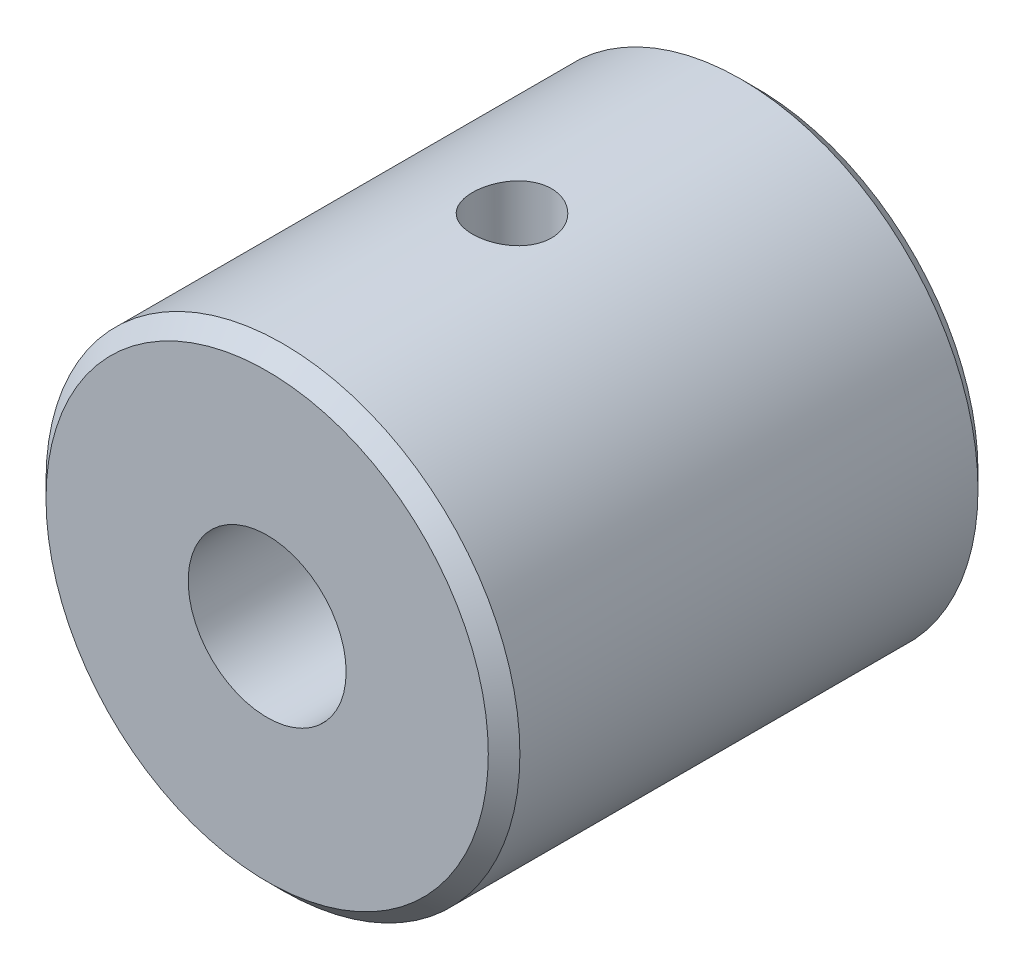
ISO-10303-21;
HEADER;
FILE_DESCRIPTION(('STEP AP214'),'2;1');
FILE_NAME('part.step','',(''),(''),'','','');
FILE_SCHEMA(('AUTOMOTIVE_DESIGN { 1 0 10303 214 1 1 1 1 }'));
ENDSEC;
DATA;
#1=APPLICATION_CONTEXT('core data for automotive mechanical design processes');
#2=APPLICATION_PROTOCOL_DEFINITION('international standard','automotive_design',2000,#1);
#3=PRODUCT_CONTEXT('',#1,'mechanical');
#4=PRODUCT('Part','Part','',(#3));
#5=PRODUCT_RELATED_PRODUCT_CATEGORY('part','',(#4));
#6=PRODUCT_DEFINITION_FORMATION('','',#4);
#7=PRODUCT_DEFINITION_CONTEXT('part definition',#1,'design');
#8=PRODUCT_DEFINITION('design','',#6,#7);
#9=PRODUCT_DEFINITION_SHAPE('','',#8);
#10=(LENGTH_UNIT() NAMED_UNIT(*) SI_UNIT(.MILLI.,.METRE.));
#11=(NAMED_UNIT(*) PLANE_ANGLE_UNIT() SI_UNIT($,.RADIAN.));
#12=(NAMED_UNIT(*) SI_UNIT($,.STERADIAN.) SOLID_ANGLE_UNIT());
#13=UNCERTAINTY_MEASURE_WITH_UNIT(LENGTH_MEASURE(1.E-05),#10,'distance_accuracy_value','');
#14=(GEOMETRIC_REPRESENTATION_CONTEXT(3) GLOBAL_UNCERTAINTY_ASSIGNED_CONTEXT((#13)) GLOBAL_UNIT_ASSIGNED_CONTEXT((#10,
#11,#12)) REPRESENTATION_CONTEXT('',''));
#15=CARTESIAN_POINT('',(0.,0.,0.));
#16=DIRECTION('',(0.,0.,1.));
#17=DIRECTION('',(1.,0.,0.));
#18=AXIS2_PLACEMENT_3D('',#15,#16,#17);
#19=CARTESIAN_POINT('',(0.,0.,3.937));
#20=DIRECTION('',(0.,0.,-1.));
#21=DIRECTION('',(-1.,0.,0.));
#22=AXIS2_PLACEMENT_3D('',#19,#20,#21);
#23=CYLINDRICAL_SURFACE('',#22,3.81);
#24=CARTESIAN_POINT('',(0.,-3.81,0.635));
#25=CARTESIAN_POINT('',(0.0354052898593866,-3.80999939336881,0.634998580407255));
#26=CARTESIAN_POINT('',(0.0708299019870605,-3.80950134189911,0.632028892157894));
#27=CARTESIAN_POINT('',(0.140685576304953,-3.80756247615112,0.620233542673608));
#28=CARTESIAN_POINT('',(0.175115694461649,-3.80612079496668,0.611402496544453));
#29=CARTESIAN_POINT('',(0.241961605792011,-3.80245637332058,0.58815847605744));
#30=CARTESIAN_POINT('',(0.274379021581703,-3.80023427190435,0.573750067727294));
#31=CARTESIAN_POINT('',(0.336332027862398,-3.79525333678846,0.539772277818692));
#32=CARTESIAN_POINT('',(0.365867947429162,-3.79249456448626,0.520203486519319));
#33=CARTESIAN_POINT('',(0.421506044030087,-3.78671662634411,0.476261408709604));
#34=CARTESIAN_POINT('',(0.447576677497882,-3.78369543440974,0.451848444882423));
#35=CARTESIAN_POINT('',(0.495271678659622,-3.7777486722669,0.398996416007906));
#36=CARTESIAN_POINT('',(0.516895765645307,-3.77482310810517,0.370557096970021));
#37=CARTESIAN_POINT('',(0.555210249903704,-3.76937921702984,0.310242974585948));
#38=CARTESIAN_POINT('',(0.571869456426694,-3.76686350789275,0.278348100451592));
#39=CARTESIAN_POINT('',(0.59958182481445,-3.76255226607847,0.212163770667641));
#40=CARTESIAN_POINT('',(0.610635365357666,-3.76075668475634,0.177874476945882));
#41=CARTESIAN_POINT('',(0.626723251957341,-3.7581091635806,0.108209010186439));
#42=CARTESIAN_POINT('',(0.631812053400392,-3.75724869195368,0.0728457429286464));
#43=CARTESIAN_POINT('',(0.635994848223628,-3.75654300489909,0.00175760967159828));
#44=CARTESIAN_POINT('',(0.635089265858805,-3.75669771762132,-0.0339672305584941));
#45=CARTESIAN_POINT('',(0.627353354992623,-3.75799712931343,-0.104375676763964));
#46=CARTESIAN_POINT('',(0.620584200000002,-3.75913160623005,-0.139066220100489));
#47=CARTESIAN_POINT('',(0.601409297662475,-3.76224671783596,-0.2068122147286));
#48=CARTESIAN_POINT('',(0.589003356997214,-3.76422738154611,-0.239867609897691));
#49=CARTESIAN_POINT('',(0.558845020507854,-3.76882273750861,-0.303588121153994));
#50=CARTESIAN_POINT('',(0.541067222125447,-3.77144043045261,-0.334240989144632));
#51=CARTESIAN_POINT('',(0.500687852459588,-3.77701281277412,-0.39215171773675));
#52=CARTESIAN_POINT('',(0.478085891846189,-3.77996752934189,-0.419409304043553));
#53=CARTESIAN_POINT('',(0.428366481888399,-3.78592595081466,-0.470109825795066));
#54=CARTESIAN_POINT('',(0.401196546823774,-3.7889298090484,-0.493501303709181));
#55=CARTESIAN_POINT('',(0.343289953241338,-3.79461420754768,-0.535400951716997));
#56=CARTESIAN_POINT('',(0.312553271744231,-3.79729474572995,-0.55390909034654));
#57=CARTESIAN_POINT('',(0.248337302706344,-3.802034287948,-0.585521365692616));
#58=CARTESIAN_POINT('',(0.214855736293424,-3.80409276875492,-0.598620956510139));
#59=CARTESIAN_POINT('',(0.146125779783093,-3.80735205765215,-0.618996530672479));
#60=CARTESIAN_POINT('',(0.110877537751585,-3.8085529374902,-0.626273001191324));
#61=CARTESIAN_POINT('',(0.040058314930612,-3.80995206980042,-0.634726025049128));
#62=CARTESIAN_POINT('',(0.00449598723635638,-3.81016193265247,-0.635973219238624));
#63=CARTESIAN_POINT('',(-0.0663295023140319,-3.80958718502977,-0.632520618515257));
#64=CARTESIAN_POINT('',(-0.101592675628578,-3.80880261281926,-0.627821052424031));
#65=CARTESIAN_POINT('',(-0.170600668588878,-3.80633434042303,-0.612667088268788));
#66=CARTESIAN_POINT('',(-0.204353380569887,-3.80465610619533,-0.602247663068908));
#67=CARTESIAN_POINT('',(-0.269632908754553,-3.80058793971661,-0.575987032377318));
#68=CARTESIAN_POINT('',(-0.301159599841069,-3.79819796750053,-0.560145522420641));
#69=CARTESIAN_POINT('',(-0.361398995125116,-3.79294267140812,-0.523328614327016));
#70=CARTESIAN_POINT('',(-0.390084373738036,-3.79007333395304,-0.502309090333517));
#71=CARTESIAN_POINT('',(-0.443545870717683,-3.78418970717543,-0.455793521892194));
#72=CARTESIAN_POINT('',(-0.468321704882932,-3.78117540733573,-0.430297152287725));
#73=CARTESIAN_POINT('',(-0.513522666033133,-3.77530404509905,-0.375234822789858));
#74=CARTESIAN_POINT('',(-0.533900065322884,-3.77244893498825,-0.345629441959339));
#75=CARTESIAN_POINT('',(-0.569392386814927,-3.76725568563582,-0.283374345838811));
#76=CARTESIAN_POINT('',(-0.584507475831535,-3.76491753000769,-0.250724727092216));
#77=CARTESIAN_POINT('',(-0.60897473619418,-3.76103757239217,-0.183441407865718));
#78=CARTESIAN_POINT('',(-0.618350663867178,-3.7594924919501,-0.148816543862255));
#79=CARTESIAN_POINT('',(-0.631148205259683,-3.75736540076156,-0.0784554871776719));
#80=CARTESIAN_POINT('',(-0.634570336634327,-3.75678330628811,-0.0427193913880582));
#81=CARTESIAN_POINT('',(-0.635348707976027,-3.75665170203339,0.0283731121544526));
#82=CARTESIAN_POINT('',(-0.632780074575797,-3.75708940352435,0.063728696158124));
#83=CARTESIAN_POINT('',(-0.621812279095039,-3.75892004489247,0.133497129004895));
#84=CARTESIAN_POINT('',(-0.613413135912569,-3.76031298167348,0.167909980903236));
#85=CARTESIAN_POINT('',(-0.591051520357105,-3.76389228495557,0.234787043072325));
#86=CARTESIAN_POINT('',(-0.577095516012512,-3.76607772873796,0.267253468554231));
#87=CARTESIAN_POINT('',(-0.544024058994641,-3.77099669706241,0.329396259975492));
#88=CARTESIAN_POINT('',(-0.524908350422135,-3.77373024878653,0.359072487434523));
#89=CARTESIAN_POINT('',(-0.481791996630527,-3.77947797327588,0.41517203810937));
#90=CARTESIAN_POINT('',(-0.457736083152786,-3.78249509076381,0.44155258824187));
#91=CARTESIAN_POINT('',(-0.405538693970578,-3.78844650579654,0.489928307536634));
#92=CARTESIAN_POINT('',(-0.377396276679809,-3.79138078406743,0.511922463234096));
#93=CARTESIAN_POINT('',(-0.317593769088631,-3.79685938529124,0.551039860122787));
#94=CARTESIAN_POINT('',(-0.285910728033335,-3.79940087528288,0.56812841398549));
#95=CARTESIAN_POINT('',(-0.220094319622261,-3.80377996570851,0.59671444909092));
#96=CARTESIAN_POINT('',(-0.185963431686822,-3.8056182667708,0.608217498594243));
#97=CARTESIAN_POINT('',(-0.126416640751531,-3.80798270871571,0.622809339628173));
#98=CARTESIAN_POINT('',(-0.101360942895805,-3.80873514927433,0.627373515282455));
#99=CARTESIAN_POINT('',(-0.0508734848212311,-3.80974400860475,0.633469329412567));
#100=CARTESIAN_POINT('',(-0.0254417310845573,-3.81000043591643,0.63500102009889));
#101=CARTESIAN_POINT('',(0.,-3.81,0.635));
#102=B_SPLINE_CURVE_WITH_KNOTS('',3,(#24,#25,#26,#27,#28,#29,#30,#31,#32,#33,#34,#35,#36,#37,
#38,#39,#40,#41,#42,#43,#44,#45,#46,#47,#48,#49,#50,#51,#52,#53,#54,#55,#56,#57,#58,#59,#60,#61,
#62,#63,#64,#65,#66,#67,#68,#69,#70,#71,#72,#73,#74,#75,#76,#77,#78,#79,#80,#81,#82,#83,#84,#85,
#86,#87,#88,#89,#90,#91,#92,#93,#94,#95,#96,#97,#98,#99,#100,#101),.UNSPECIFIED.,.T.,.F.,(4,2,2,
2,2,2,2,2,2,2,2,2,2,2,2,2,2,2,2,2,2,2,2,2,2,2,2,2,2,2,2,2,2,2,2,2,2,2,4),(0.,0.106122872574381,
0.212343376606637,0.318477104224419,0.424598696819397,0.531628327298323,0.638664712431436,
0.746360002892554,0.8540480172655,0.960745035842696,1.06743450297505,1.17302412527144,
1.27861736916447,1.3847179738467,1.49082714452866,1.59825123557477,1.70567601875505,
1.81319090984639,1.92069680508372,2.02694002406815,2.13317915511108,2.2387758297963,
2.34437843499821,2.45091413709264,2.55745758015788,2.66510470789935,2.7727484229349,
2.8799434967481,2.98712924997801,3.09297809018766,3.19882658731786,3.30455223829461,
3.41028313377451,3.51726851585122,3.62427858805259,3.73202766828229,3.83966911041038,
3.91592879033661,3.9921871572835),.UNSPECIFIED.);
#103=CARTESIAN_POINT('',(0.,-3.81,0.635));
#104=VERTEX_POINT('',#103);
#105=EDGE_CURVE('E76',#104,#104,#102,.T.);
#106=ORIENTED_EDGE('',*,*,#105,.T.);
#107=EDGE_LOOP('',(#106));
#108=FACE_BOUND('',#107,.T.);
#109=CARTESIAN_POINT('',(0.,3.81,0.635));
#110=CARTESIAN_POINT('',(-0.0354052898593866,3.80999939336881,0.634998580407255));
#111=CARTESIAN_POINT('',(-0.0708299019870606,3.8095013418991,0.632028892157894));
#112=CARTESIAN_POINT('',(-0.140685576304953,3.80756247615112,0.620233542673608));
#113=CARTESIAN_POINT('',(-0.175115694461649,3.80612079496668,0.611402496544453));
#114=CARTESIAN_POINT('',(-0.241961605792012,3.80245637332058,0.58815847605744));
#115=CARTESIAN_POINT('',(-0.274379021581703,3.80023427190435,0.573750067727294));
#116=CARTESIAN_POINT('',(-0.336332027862398,3.79525333678846,0.539772277818691));
#117=CARTESIAN_POINT('',(-0.365867947429162,3.79249456448626,0.520203486519318));
#118=CARTESIAN_POINT('',(-0.421506044030087,3.78671662634411,0.476261408709603));
#119=CARTESIAN_POINT('',(-0.447576677497882,3.78369543440974,0.451848444882423));
#120=CARTESIAN_POINT('',(-0.495271678659622,3.7777486722669,0.398996416007906));
#121=CARTESIAN_POINT('',(-0.516895765645307,3.77482310810517,0.37055709697002));
#122=CARTESIAN_POINT('',(-0.555210249903704,3.76937921702984,0.310242974585947));
#123=CARTESIAN_POINT('',(-0.571869456426695,3.76686350789275,0.278348100451591));
#124=CARTESIAN_POINT('',(-0.59958182481445,3.76255226607847,0.21216377066764));
#125=CARTESIAN_POINT('',(-0.610635365357666,3.76075668475634,0.177874476945881));
#126=CARTESIAN_POINT('',(-0.626723251957341,3.7581091635806,0.108209010186439));
#127=CARTESIAN_POINT('',(-0.631812053400392,3.75724869195368,0.0728457429286459));
#128=CARTESIAN_POINT('',(-0.635994848223628,3.75654300489909,0.00175760967159773));
#129=CARTESIAN_POINT('',(-0.635089265858805,3.75669771762132,-0.0339672305584946));
#130=CARTESIAN_POINT('',(-0.627353354992622,3.75799712931343,-0.104375676763964));
#131=CARTESIAN_POINT('',(-0.620584200000002,3.75913160623005,-0.13906622010049));
#132=CARTESIAN_POINT('',(-0.601409297662475,3.76224671783596,-0.2068122147286));
#133=CARTESIAN_POINT('',(-0.589003356997214,3.76422738154611,-0.239867609897691));
#134=CARTESIAN_POINT('',(-0.558845020507854,3.76882273750861,-0.303588121153994));
#135=CARTESIAN_POINT('',(-0.541067222125447,3.77144043045261,-0.334240989144632));
#136=CARTESIAN_POINT('',(-0.500687852459588,3.77701281277412,-0.39215171773675));
#137=CARTESIAN_POINT('',(-0.478085891846189,3.77996752934189,-0.419409304043553));
#138=CARTESIAN_POINT('',(-0.428366481888399,3.78592595081466,-0.470109825795066));
#139=CARTESIAN_POINT('',(-0.401196546823774,3.7889298090484,-0.493501303709181));
#140=CARTESIAN_POINT('',(-0.343289953241338,3.79461420754768,-0.535400951716997));
#141=CARTESIAN_POINT('',(-0.312553271744231,3.79729474572995,-0.55390909034654));
#142=CARTESIAN_POINT('',(-0.248337302706344,3.802034287948,-0.585521365692616));
#143=CARTESIAN_POINT('',(-0.214855736293424,3.80409276875492,-0.598620956510139));
#144=CARTESIAN_POINT('',(-0.146125779783093,3.80735205765215,-0.618996530672479));
#145=CARTESIAN_POINT('',(-0.110877537751585,3.8085529374902,-0.626273001191324));
#146=CARTESIAN_POINT('',(-0.0400583149306122,3.80995206980042,-0.634726025049128));
#147=CARTESIAN_POINT('',(-0.00449598723635661,3.81016193265247,-0.635973219238624));
#148=CARTESIAN_POINT('',(0.0663295023140317,3.80958718502977,-0.632520618515257));
#149=CARTESIAN_POINT('',(0.101592675628578,3.80880261281926,-0.627821052424031));
#150=CARTESIAN_POINT('',(0.170600668588878,3.80633434042303,-0.612667088268789));
#151=CARTESIAN_POINT('',(0.204353380569887,3.80465610619533,-0.602247663068908));
#152=CARTESIAN_POINT('',(0.269632908754553,3.80058793971661,-0.575987032377318));
#153=CARTESIAN_POINT('',(0.301159599841069,3.79819796750053,-0.560145522420641));
#154=CARTESIAN_POINT('',(0.361398995125116,3.79294267140812,-0.523328614327016));
#155=CARTESIAN_POINT('',(0.390084373738036,3.79007333395304,-0.502309090333518));
#156=CARTESIAN_POINT('',(0.443545870717683,3.78418970717543,-0.455793521892195));
#157=CARTESIAN_POINT('',(0.468321704882932,3.78117540733573,-0.430297152287726));
#158=CARTESIAN_POINT('',(0.513522666033133,3.77530404509905,-0.375234822789858));
#159=CARTESIAN_POINT('',(0.533900065322884,3.77244893498825,-0.345629441959339));
#160=CARTESIAN_POINT('',(0.569392386814927,3.76725568563582,-0.28337434583881));
#161=CARTESIAN_POINT('',(0.584507475831535,3.76491753000769,-0.250724727092216));
#162=CARTESIAN_POINT('',(0.60897473619418,3.76103757239217,-0.183441407865718));
#163=CARTESIAN_POINT('',(0.618350663867178,3.7594924919501,-0.148816543862255));
#164=CARTESIAN_POINT('',(0.631148205259683,3.75736540076156,-0.0784554871776718));
#165=CARTESIAN_POINT('',(0.634570336634327,3.75678330628811,-0.042719391388058));
#166=CARTESIAN_POINT('',(0.635348707976027,3.75665170203339,0.0283731121544527));
#167=CARTESIAN_POINT('',(0.632780074575797,3.75708940352435,0.063728696158124));
#168=CARTESIAN_POINT('',(0.621812279095039,3.75892004489247,0.133497129004895));
#169=CARTESIAN_POINT('',(0.613413135912569,3.76031298167348,0.167909980903236));
#170=CARTESIAN_POINT('',(0.591051520357105,3.76389228495557,0.234787043072325));
#171=CARTESIAN_POINT('',(0.577095516012512,3.76607772873796,0.267253468554231));
#172=CARTESIAN_POINT('',(0.54402405899464,3.77099669706241,0.329396259975492));
#173=CARTESIAN_POINT('',(0.524908350422134,3.77373024878653,0.359072487434523));
#174=CARTESIAN_POINT('',(0.481791996630527,3.77947797327588,0.41517203810937));
#175=CARTESIAN_POINT('',(0.457736083152786,3.78249509076381,0.44155258824187));
#176=CARTESIAN_POINT('',(0.405538693970578,3.78844650579654,0.489928307536634));
#177=CARTESIAN_POINT('',(0.377396276679809,3.79138078406743,0.511922463234096));
#178=CARTESIAN_POINT('',(0.317593769088631,3.79685938529124,0.551039860122787));
#179=CARTESIAN_POINT('',(0.285910728033335,3.79940087528288,0.56812841398549));
#180=CARTESIAN_POINT('',(0.22009431962226,3.80377996570851,0.59671444909092));
#181=CARTESIAN_POINT('',(0.185963431686821,3.8056182667708,0.608217498594243));
#182=CARTESIAN_POINT('',(0.126416640751531,3.80798270871571,0.622809339628173));
#183=CARTESIAN_POINT('',(0.101360942895805,3.80873514927433,0.627373515282455));
#184=CARTESIAN_POINT('',(0.0508734848212312,3.80974400860475,0.633469329412567));
#185=CARTESIAN_POINT('',(0.0254417310845573,3.81000043591643,0.63500102009889));
#186=CARTESIAN_POINT('',(0.,3.81,0.635));
#187=B_SPLINE_CURVE_WITH_KNOTS('',3,(#109,#110,#111,#112,#113,#114,#115,#116,#117,#118,#119,
#120,#121,#122,#123,#124,#125,#126,#127,#128,#129,#130,#131,#132,#133,#134,#135,#136,#137,#138,
#139,#140,#141,#142,#143,#144,#145,#146,#147,#148,#149,#150,#151,#152,#153,#154,#155,#156,#157,
#158,#159,#160,#161,#162,#163,#164,#165,#166,#167,#168,#169,#170,#171,#172,#173,#174,#175,#176,
#177,#178,#179,#180,#181,#182,#183,#184,#185,#186),.UNSPECIFIED.,.T.,.F.,(4,2,2,2,2,2,2,2,2,2,2,
2,2,2,2,2,2,2,2,2,2,2,2,2,2,2,2,2,2,2,2,2,2,2,2,2,2,2,4),(0.,0.106122872574382,
0.212343376606637,0.318477104224419,0.424598696819397,0.531628327298324,0.638664712431437,
0.746360002892554,0.854048017265501,0.960745035842697,1.06743450297505,1.17302412527144,
1.27861736916447,1.3847179738467,1.49082714452866,1.59825123557477,1.70567601875505,
1.81319090984639,1.92069680508372,2.02694002406815,2.13317915511108,2.2387758297963,
2.34437843499821,2.45091413709264,2.55745758015788,2.66510470789935,2.7727484229349,
2.8799434967481,2.98712924997801,3.09297809018766,3.19882658731786,3.30455223829461,
3.41028313377451,3.51726851585122,3.62427858805259,3.73202766828229,3.83966911041038,
3.91592879033661,3.9921871572835),.UNSPECIFIED.);
#188=CARTESIAN_POINT('',(0.,3.81,0.635));
#189=VERTEX_POINT('',#188);
#190=EDGE_CURVE('E70',#189,#189,#187,.T.);
#191=ORIENTED_EDGE('',*,*,#190,.T.);
#192=EDGE_LOOP('',(#191));
#193=FACE_BOUND('',#192,.T.);
#194=CARTESIAN_POINT('',(0.,0.,-3.683));
#195=DIRECTION('',(0.,0.,1.));
#196=DIRECTION('',(1.,0.,0.));
#197=AXIS2_PLACEMENT_3D('',#194,#195,#196);
#198=CIRCLE('',#197,3.81);
#199=CARTESIAN_POINT('',(3.81,0.,-3.683));
#200=VERTEX_POINT('',#199);
#201=EDGE_CURVE('E49',#200,#200,#198,.T.);
#202=ORIENTED_EDGE('',*,*,#201,.T.);
#203=EDGE_LOOP('',(#202));
#204=FACE_BOUND('',#203,.T.);
#205=CARTESIAN_POINT('',(0.,0.,3.683));
#206=DIRECTION('',(0.,0.,1.));
#207=DIRECTION('',(1.,0.,0.));
#208=AXIS2_PLACEMENT_3D('',#205,#206,#207);
#209=CIRCLE('',#208,3.81);
#210=CARTESIAN_POINT('',(3.81,0.,3.683));
#211=VERTEX_POINT('',#210);
#212=EDGE_CURVE('E102',#211,#211,#209,.F.);
#213=ORIENTED_EDGE('',*,*,#212,.T.);
#214=EDGE_LOOP('',(#213));
#215=FACE_BOUND('',#214,.T.);
#216=ADVANCED_FACE('F31',(#108,#193,#204,#215),#23,.T.);
#217=CARTESIAN_POINT('',(0.,0.,3.937));
#218=DIRECTION('',(0.,0.,1.));
#219=DIRECTION('',(1.,0.,0.));
#220=AXIS2_PLACEMENT_3D('',#217,#218,#219);
#221=PLANE('',#220);
#222=CARTESIAN_POINT('',(0.,0.,3.937));
#223=DIRECTION('',(0.,0.,1.));
#224=DIRECTION('',(1.,0.,0.));
#225=AXIS2_PLACEMENT_3D('',#222,#223,#224);
#226=CIRCLE('',#225,1.27);
#227=CARTESIAN_POINT('',(1.27,0.,3.937));
#228=VERTEX_POINT('',#227);
#229=EDGE_CURVE('E108',#228,#228,#226,.T.);
#230=ORIENTED_EDGE('',*,*,#229,.F.);
#231=EDGE_LOOP('',(#230));
#232=FACE_BOUND('',#231,.T.);
#233=CARTESIAN_POINT('',(0.,0.,3.937));
#234=DIRECTION('',(0.,0.,1.));
#235=DIRECTION('',(1.,0.,0.));
#236=AXIS2_PLACEMENT_3D('',#233,#234,#235);
#237=CIRCLE('',#236,3.556);
#238=CARTESIAN_POINT('',(3.556,0.,3.937));
#239=VERTEX_POINT('',#238);
#240=EDGE_CURVE('E10',#239,#239,#237,.T.);
#241=ORIENTED_EDGE('',*,*,#240,.T.);
#242=EDGE_LOOP('',(#241));
#243=FACE_BOUND('',#242,.T.);
#244=ADVANCED_FACE('F84',(#232,#243),#221,.T.);
#245=CARTESIAN_POINT('',(0.,0.,-3.937));
#246=DIRECTION('',(0.,0.,1.));
#247=DIRECTION('',(1.,0.,0.));
#248=AXIS2_PLACEMENT_3D('',#245,#246,#247);
#249=PLANE('',#248);
#250=CARTESIAN_POINT('',(0.,0.,-3.937));
#251=DIRECTION('',(0.,0.,1.));
#252=DIRECTION('',(1.,0.,0.));
#253=AXIS2_PLACEMENT_3D('',#250,#251,#252);
#254=CIRCLE('',#253,1.27);
#255=CARTESIAN_POINT('',(1.27,0.,-3.937));
#256=VERTEX_POINT('',#255);
#257=EDGE_CURVE('E104',#256,#256,#254,.T.);
#258=ORIENTED_EDGE('',*,*,#257,.T.);
#259=EDGE_LOOP('',(#258));
#260=FACE_BOUND('',#259,.T.);
#261=CARTESIAN_POINT('',(0.,0.,-3.937));
#262=DIRECTION('',(0.,0.,1.));
#263=DIRECTION('',(1.,0.,0.));
#264=AXIS2_PLACEMENT_3D('',#261,#262,#263);
#265=CIRCLE('',#264,3.556);
#266=CARTESIAN_POINT('',(3.556,0.,-3.937));
#267=VERTEX_POINT('',#266);
#268=EDGE_CURVE('E44',#267,#267,#265,.F.);
#269=ORIENTED_EDGE('',*,*,#268,.T.);
#270=EDGE_LOOP('',(#269));
#271=FACE_BOUND('',#270,.T.);
#272=ADVANCED_FACE('F86',(#260,#271),#249,.F.);
#273=CARTESIAN_POINT('',(0.,0.,-3.683));
#274=DIRECTION('',(0.,0.,1.));
#275=DIRECTION('',(1.,0.,0.));
#276=AXIS2_PLACEMENT_3D('',#273,#274,#275);
#277=CONICAL_SURFACE('',#276,3.81,0.785398163397454);
#278=ORIENTED_EDGE('',*,*,#268,.F.);
#279=EDGE_LOOP('',(#278));
#280=FACE_BOUND('',#279,.T.);
#281=ORIENTED_EDGE('',*,*,#201,.F.);
#282=EDGE_LOOP('',(#281));
#283=FACE_BOUND('',#282,.T.);
#284=ADVANCED_FACE('F87',(#280,#283),#277,.T.);
#285=CARTESIAN_POINT('',(0.,0.,3.937));
#286=DIRECTION('',(0.,0.,-1.));
#287=DIRECTION('',(-1.,0.,0.));
#288=AXIS2_PLACEMENT_3D('',#285,#286,#287);
#289=CONICAL_SURFACE('',#288,3.556,0.785398163397447);
#290=ORIENTED_EDGE('',*,*,#212,.F.);
#291=EDGE_LOOP('',(#290));
#292=FACE_BOUND('',#291,.T.);
#293=ORIENTED_EDGE('',*,*,#240,.F.);
#294=EDGE_LOOP('',(#293));
#295=FACE_BOUND('',#294,.T.);
#296=ADVANCED_FACE('F33',(#292,#295),#289,.T.);
#297=CARTESIAN_POINT('',(0.,0.,-3.937));
#298=DIRECTION('',(0.,0.,1.));
#299=DIRECTION('',(1.,0.,0.));
#300=AXIS2_PLACEMENT_3D('',#297,#298,#299);
#301=CYLINDRICAL_SURFACE('',#300,1.27);
#302=CARTESIAN_POINT('',(0.,-1.27,0.635));
#303=CARTESIAN_POINT('',(-0.0333831964751464,-1.26999818011636,0.634997903027117));
#304=CARTESIAN_POINT('',(-0.0668061908082506,-1.26866961797394,0.632352003567736));
#305=CARTESIAN_POINT('',(-0.13266434939545,-1.26348589083747,0.621885420983517));
#306=CARTESIAN_POINT('',(-0.165097515063075,-1.25962592771405,0.614054910446492));
#307=CARTESIAN_POINT('',(-0.227922800999165,-1.24978337421103,0.593601931528336));
#308=CARTESIAN_POINT('',(-0.258322319866379,-1.24380903877725,0.580998086002512));
#309=CARTESIAN_POINT('',(-0.316530111672168,-1.23028568087519,0.551452655433263));
#310=CARTESIAN_POINT('',(-0.344338588683681,-1.22273678257292,0.534511412401979));
#311=CARTESIAN_POINT('',(-0.398467464278818,-1.20622223993866,0.495606546576836));
#312=CARTESIAN_POINT('',(-0.424596059062541,-1.19719851445985,0.473401085682828));
#313=CARTESIAN_POINT('',(-0.47293494749053,-1.17894081106683,0.425118860678134));
#314=CARTESIAN_POINT('',(-0.495142255272796,-1.16970667892737,0.399039174124501));
#315=CARTESIAN_POINT('',(-0.536735020285927,-1.15124834010315,0.341323073052653));
#316=CARTESIAN_POINT('',(-0.555768088075289,-1.14208043726034,0.309412577550346));
#317=CARTESIAN_POINT('',(-0.588116824075591,-1.12576596520424,0.242336741648754));
#318=CARTESIAN_POINT('',(-0.601436576503622,-1.11861795330438,0.207173748261055));
#319=CARTESIAN_POINT('',(-0.621114100789754,-1.10780745569008,0.13673765805708));
#320=CARTESIAN_POINT('',(-0.62784091924608,-1.10396192455658,0.101597172937205));
#321=CARTESIAN_POINT('',(-0.635271140751117,-1.09970500117315,0.0304934380100325));
#322=CARTESIAN_POINT('',(-0.635980496116902,-1.09929021532988,-0.00546896345318303));
#323=CARTESIAN_POINT('',(-0.631626427354407,-1.10179440713353,-0.0725716254402588));
#324=CARTESIAN_POINT('',(-0.627243195305882,-1.10432064925379,-0.103774259826637));
#325=CARTESIAN_POINT('',(-0.614006804151152,-1.11173405245995,-0.164923412451882));
#326=CARTESIAN_POINT('',(-0.605152221175009,-1.11662196558178,-0.194869527268876));
#327=CARTESIAN_POINT('',(-0.583063210545112,-1.12831547522091,-0.253510499179194));
#328=CARTESIAN_POINT('',(-0.569731567618657,-1.13516308821639,-0.282159963228976));
#329=CARTESIAN_POINT('',(-0.539141471669181,-1.15000661718691,-0.336952775794655));
#330=CARTESIAN_POINT('',(-0.521881254820917,-1.15800304835421,-0.363094991106056));
#331=CARTESIAN_POINT('',(-0.481371944869621,-1.17546855268587,-0.415620995491949));
#332=CARTESIAN_POINT('',(-0.457640981064494,-1.18499579000334,-0.44161511472086));
#333=CARTESIAN_POINT('',(-0.406117792500772,-1.20362740795759,-0.489416990805223));
#334=CARTESIAN_POINT('',(-0.378323637924671,-1.21273158493839,-0.511222746941516));
#335=CARTESIAN_POINT('',(-0.317827981203223,-1.23000761924682,-0.550980394753877));
#336=CARTESIAN_POINT('',(-0.284958530665624,-1.23811654942875,-0.568706300003045));
#337=CARTESIAN_POINT('',(-0.216196046835386,-1.25195254511989,-0.598231613442311));
#338=CARTESIAN_POINT('',(-0.18030544092845,-1.25768150129156,-0.610035727484631));
#339=CARTESIAN_POINT('',(-0.109706722204546,-1.26570951925812,-0.626411881360089));
#340=CARTESIAN_POINT('',(-0.0751468718981858,-1.26825335821333,-0.631501934699204));
#341=CARTESIAN_POINT('',(-0.00557504596783951,-1.2704636354653,-0.635930104270401));
#342=CARTESIAN_POINT('',(0.0294367076173873,-1.27013143688033,-0.635270945381069));
#343=CARTESIAN_POINT('',(0.0960329372111057,-1.26676907080935,-0.628518752854091));
#344=CARTESIAN_POINT('',(0.127672724111721,-1.26395001012,-0.622850841716431));
#345=CARTESIAN_POINT('',(0.189488376611717,-1.2561707878491,-0.606908824346621));
#346=CARTESIAN_POINT('',(0.219664080413783,-1.25121039022301,-0.596634210302117));
#347=CARTESIAN_POINT('',(0.278694266365537,-1.2394199964768,-0.571500973814936));
#348=CARTESIAN_POINT('',(0.307486302098907,-1.23254059923911,-0.556519683175824));
#349=CARTESIAN_POINT('',(0.362242964678814,-1.21757423691364,-0.522536714864764));
#350=CARTESIAN_POINT('',(0.388206379907304,-1.20948675784274,-0.503533324533171));
#351=CARTESIAN_POINT('',(0.439272482699565,-1.1919472054929,-0.459892129913625));
#352=CARTESIAN_POINT('',(0.464040269418646,-1.1824391187876,-0.434884278531986));
#353=CARTESIAN_POINT('',(0.509178763906907,-1.1637161866846,-0.381047528943992));
#354=CARTESIAN_POINT('',(0.529546429913684,-1.15450154787269,-0.352216009551603));
#355=CARTESIAN_POINT('',(0.566234525706037,-1.13697507063553,-0.289786279582803));
#356=CARTESIAN_POINT('',(0.582311189882935,-1.12872856336305,-0.256024845957543));
#357=CARTESIAN_POINT('',(0.608382594518765,-1.1148953595376,-0.18573110701525));
#358=CARTESIAN_POINT('',(0.618385171588607,-1.10930523782792,-0.149202440671747));
#359=CARTESIAN_POINT('',(0.631102171530546,-1.10211553140503,-0.078162008482981));
#360=CARTESIAN_POINT('',(0.634424052714549,-1.10018438497412,-0.0437932490725628));
#361=CARTESIAN_POINT('',(0.6354376130318,-1.09960000200321,0.025048887653412));
#362=CARTESIAN_POINT('',(0.633131732606493,-1.10094534463496,0.0595222131495398));
#363=CARTESIAN_POINT('',(0.623523089751087,-1.10641042401766,0.124132023472829));
#364=CARTESIAN_POINT('',(0.616717279607678,-1.1102536499632,0.154368798541694));
#365=CARTESIAN_POINT('',(0.59891635247265,-1.11995595279328,0.213238155834688));
#366=CARTESIAN_POINT('',(0.58791988788648,-1.12581567806744,0.241870218628399));
#367=CARTESIAN_POINT('',(0.561222998265934,-1.13937116781475,0.298846780376495));
#368=CARTESIAN_POINT('',(0.545256172513451,-1.14716383721581,0.32704271766186));
#369=CARTESIAN_POINT('',(0.509365866989263,-1.16354435587965,0.380539330474672));
#370=CARTESIAN_POINT('',(0.489440328736542,-1.17213261759522,0.405838488879241));
#371=CARTESIAN_POINT('',(0.443359112432047,-1.19038575206164,0.456020158797086));
#372=CARTESIAN_POINT('',(0.416740608611459,-1.20005464402783,0.48047852999982));
#373=CARTESIAN_POINT('',(0.359508301949878,-1.21842372681981,0.524676994474007));
#374=CARTESIAN_POINT('',(0.328892359268058,-1.22712339416105,0.544414544535694));
#375=CARTESIAN_POINT('',(0.264116563980666,-1.24268236086541,0.578635090354));
#376=CARTESIAN_POINT('',(0.22993318499848,-1.24952821317447,0.593079947576261));
#377=CARTESIAN_POINT('',(0.159221234321811,-1.26048351765801,0.615828186628535));
#378=CARTESIAN_POINT('',(0.12269965276071,-1.26460074341812,0.624149022736782));
#379=CARTESIAN_POINT('',(0.0715022360169485,-1.26806618312636,0.631124856033164));
#380=CARTESIAN_POINT('',(0.0572527934440813,-1.26878946990393,0.632575976948398));
#381=CARTESIAN_POINT('',(0.0286713496975448,-1.26975677580944,0.634514012603172));
#382=CARTESIAN_POINT('',(0.014339346256087,-1.2700007817089,0.635000900729212));
#383=CARTESIAN_POINT('',(0.,-1.27,0.635));
#384=B_SPLINE_CURVE_WITH_KNOTS('',3,(#302,#303,#304,#305,#306,#307,#308,#309,#310,#311,#312,
#313,#314,#315,#316,#317,#318,#319,#320,#321,#322,#323,#324,#325,#326,#327,#328,#329,#330,#331,
#332,#333,#334,#335,#336,#337,#338,#339,#340,#341,#342,#343,#344,#345,#346,#347,#348,#349,#350,
#351,#352,#353,#354,#355,#356,#357,#358,#359,#360,#361,#362,#363,#364,#365,#366,#367,#368,#369,
#370,#371,#372,#373,#374,#375,#376,#377,#378,#379,#380,#381,#382,#383),.UNSPECIFIED.,.T.,.F.,(4,
2,2,2,2,2,2,2,2,2,2,2,2,2,2,2,2,2,2,2,2,2,2,2,2,2,2,2,2,2,2,2,2,2,2,2,2,2,2,2,4),(0.,
0.100091403461886,0.20037307506534,0.300267468737609,0.400153987969295,0.506083416785986,
0.612093160910312,0.726323962835279,0.840472969154083,0.947788377090457,1.05499761903928,
1.14938627379919,1.24380500492806,1.34042302506989,1.43708451000241,1.54600237747013,
1.65497214470166,1.7690021910617,1.88294147739298,1.98744389449305,2.09189678464787,
2.18825385631387,2.28462155235642,2.38374463577716,2.48291001225195,2.59181352759206,
2.70079208770799,2.81504823171393,2.92915665082394,3.03231110261467,3.13542083011103,
3.22870785705056,3.32202490777636,3.42161150052515,3.52125001323238,3.63299529147837,
3.74480063444124,3.85739648675958,3.96967016976831,4.01266202887438,4.05565507456928),.UNSPECIFIED.);
#385=CARTESIAN_POINT('',(0.,-1.27,0.635));
#386=VERTEX_POINT('',#385);
#387=EDGE_CURVE('E35',#386,#386,#384,.T.);
#388=ORIENTED_EDGE('',*,*,#387,.T.);
#389=EDGE_LOOP('',(#388));
#390=FACE_BOUND('',#389,.T.);
#391=CARTESIAN_POINT('',(0.,1.27,0.635));
#392=CARTESIAN_POINT('',(0.0333831964751464,1.26999818011636,0.634997903027117));
#393=CARTESIAN_POINT('',(0.0668061908082507,1.26866961797394,0.632352003567736));
#394=CARTESIAN_POINT('',(0.13266434939545,1.26348589083747,0.621885420983517));
#395=CARTESIAN_POINT('',(0.165097515063075,1.25962592771405,0.614054910446492));
#396=CARTESIAN_POINT('',(0.227922800999165,1.24978337421103,0.593601931528335));
#397=CARTESIAN_POINT('',(0.258322319866379,1.24380903877725,0.580998086002512));
#398=CARTESIAN_POINT('',(0.316530111672169,1.23028568087519,0.551452655433263));
#399=CARTESIAN_POINT('',(0.344338588683682,1.22273678257292,0.534511412401979));
#400=CARTESIAN_POINT('',(0.398467464278819,1.20622223993866,0.495606546576835));
#401=CARTESIAN_POINT('',(0.424596059062541,1.19719851445985,0.473401085682827));
#402=CARTESIAN_POINT('',(0.472934947490531,1.17894081106683,0.425118860678134));
#403=CARTESIAN_POINT('',(0.495142255272797,1.16970667892737,0.3990391741245));
#404=CARTESIAN_POINT('',(0.536735020285927,1.15124834010315,0.341323073052652));
#405=CARTESIAN_POINT('',(0.55576808807529,1.14208043726034,0.309412577550345));
#406=CARTESIAN_POINT('',(0.588116824075592,1.12576596520424,0.242336741648753));
#407=CARTESIAN_POINT('',(0.601436576503622,1.11861795330438,0.207173748261054));
#408=CARTESIAN_POINT('',(0.621114100789754,1.10780745569008,0.136737658057079));
#409=CARTESIAN_POINT('',(0.62784091924608,1.10396192455658,0.101597172937204));
#410=CARTESIAN_POINT('',(0.635271140751117,1.09970500117315,0.0304934380100318));
#411=CARTESIAN_POINT('',(0.635980496116902,1.09929021532988,-0.00546896345318366));
#412=CARTESIAN_POINT('',(0.631626427354407,1.10179440713353,-0.0725716254402592));
#413=CARTESIAN_POINT('',(0.627243195305882,1.10432064925379,-0.103774259826637));
#414=CARTESIAN_POINT('',(0.614006804151152,1.11173405245995,-0.164923412451882));
#415=CARTESIAN_POINT('',(0.605152221175009,1.11662196558178,-0.194869527268876));
#416=CARTESIAN_POINT('',(0.583063210545112,1.12831547522091,-0.253510499179194));
#417=CARTESIAN_POINT('',(0.569731567618657,1.13516308821639,-0.282159963228976));
#418=CARTESIAN_POINT('',(0.539141471669181,1.15000661718691,-0.336952775794655));
#419=CARTESIAN_POINT('',(0.521881254820917,1.15800304835421,-0.363094991106056));
#420=CARTESIAN_POINT('',(0.481371944869621,1.17546855268587,-0.415620995491948));
#421=CARTESIAN_POINT('',(0.457640981064494,1.18499579000334,-0.44161511472086));
#422=CARTESIAN_POINT('',(0.406117792500772,1.20362740795759,-0.489416990805222));
#423=CARTESIAN_POINT('',(0.378323637924671,1.21273158493839,-0.511222746941515));
#424=CARTESIAN_POINT('',(0.317827981203224,1.23000761924682,-0.550980394753877));
#425=CARTESIAN_POINT('',(0.284958530665625,1.23811654942875,-0.568706300003045));
#426=CARTESIAN_POINT('',(0.216196046835386,1.25195254511989,-0.598231613442311));
#427=CARTESIAN_POINT('',(0.180305440928451,1.25768150129156,-0.610035727484631));
#428=CARTESIAN_POINT('',(0.109706722204546,1.26570951925812,-0.626411881360089));
#429=CARTESIAN_POINT('',(0.0751468718981861,1.26825335821333,-0.631501934699204));
#430=CARTESIAN_POINT('',(0.00557504596783974,1.2704636354653,-0.635930104270401));
#431=CARTESIAN_POINT('',(-0.0294367076173872,1.27013143688033,-0.635270945381069));
#432=CARTESIAN_POINT('',(-0.0960329372111058,1.26676907080935,-0.628518752854091));
#433=CARTESIAN_POINT('',(-0.127672724111721,1.26395001012,-0.622850841716431));
#434=CARTESIAN_POINT('',(-0.189488376611717,1.2561707878491,-0.606908824346621));
#435=CARTESIAN_POINT('',(-0.219664080413783,1.25121039022301,-0.596634210302117));
#436=CARTESIAN_POINT('',(-0.278694266365538,1.2394199964768,-0.571500973814936));
#437=CARTESIAN_POINT('',(-0.307486302098908,1.23254059923911,-0.556519683175824));
#438=CARTESIAN_POINT('',(-0.362242964678815,1.21757423691364,-0.522536714864763));
#439=CARTESIAN_POINT('',(-0.388206379907304,1.20948675784274,-0.503533324533171));
#440=CARTESIAN_POINT('',(-0.439272482699565,1.1919472054929,-0.459892129913625));
#441=CARTESIAN_POINT('',(-0.464040269418646,1.1824391187876,-0.434884278531986));
#442=CARTESIAN_POINT('',(-0.509178763906907,1.1637161866846,-0.381047528943992));
#443=CARTESIAN_POINT('',(-0.529546429913684,1.15450154787269,-0.352216009551602));
#444=CARTESIAN_POINT('',(-0.566234525706037,1.13697507063553,-0.289786279582802));
#445=CARTESIAN_POINT('',(-0.582311189882935,1.12872856336305,-0.256024845957542));
#446=CARTESIAN_POINT('',(-0.608382594518765,1.1148953595376,-0.185731107015248));
#447=CARTESIAN_POINT('',(-0.618385171588607,1.10930523782792,-0.149202440671746));
#448=CARTESIAN_POINT('',(-0.631102171530546,1.10211553140503,-0.07816200848298));
#449=CARTESIAN_POINT('',(-0.634424052714549,1.10018438497412,-0.0437932490725618));
#450=CARTESIAN_POINT('',(-0.6354376130318,1.09960000200321,0.0250488876534129));
#451=CARTESIAN_POINT('',(-0.633131732606493,1.10094534463496,0.0595222131495405));
#452=CARTESIAN_POINT('',(-0.623523089751087,1.10641042401766,0.12413202347283));
#453=CARTESIAN_POINT('',(-0.616717279607678,1.1102536499632,0.154368798541694));
#454=CARTESIAN_POINT('',(-0.59891635247265,1.11995595279328,0.213238155834688));
#455=CARTESIAN_POINT('',(-0.587919887886479,1.12581567806744,0.241870218628399));
#456=CARTESIAN_POINT('',(-0.561222998265934,1.13937116781475,0.298846780376495));
#457=CARTESIAN_POINT('',(-0.545256172513451,1.14716383721581,0.32704271766186));
#458=CARTESIAN_POINT('',(-0.509365866989263,1.16354435587965,0.380539330474672));
#459=CARTESIAN_POINT('',(-0.489440328736542,1.17213261759522,0.405838488879241));
#460=CARTESIAN_POINT('',(-0.443359112432047,1.19038575206164,0.456020158797086));
#461=CARTESIAN_POINT('',(-0.416740608611459,1.20005464402783,0.48047852999982));
#462=CARTESIAN_POINT('',(-0.359508301949878,1.21842372681981,0.524676994474007));
#463=CARTESIAN_POINT('',(-0.328892359268059,1.22712339416105,0.544414544535693));
#464=CARTESIAN_POINT('',(-0.264116563980667,1.24268236086541,0.578635090354));
#465=CARTESIAN_POINT('',(-0.229933184998481,1.24952821317447,0.593079947576261));
#466=CARTESIAN_POINT('',(-0.159221234321812,1.26048351765801,0.615828186628534));
#467=CARTESIAN_POINT('',(-0.122699652760711,1.26460074341812,0.624149022736782));
#468=CARTESIAN_POINT('',(-0.0715022360169489,1.26806618312636,0.631124856033164));
#469=CARTESIAN_POINT('',(-0.057252793444082,1.26878946990393,0.632575976948398));
#470=CARTESIAN_POINT('',(-0.0286713496975454,1.26975677580944,0.634514012603172));
#471=CARTESIAN_POINT('',(-0.0143393462560874,1.2700007817089,0.635000900729212));
#472=CARTESIAN_POINT('',(0.,1.27,0.635));
#473=B_SPLINE_CURVE_WITH_KNOTS('',3,(#391,#392,#393,#394,#395,#396,#397,#398,#399,#400,#401,
#402,#403,#404,#405,#406,#407,#408,#409,#410,#411,#412,#413,#414,#415,#416,#417,#418,#419,#420,
#421,#422,#423,#424,#425,#426,#427,#428,#429,#430,#431,#432,#433,#434,#435,#436,#437,#438,#439,
#440,#441,#442,#443,#444,#445,#446,#447,#448,#449,#450,#451,#452,#453,#454,#455,#456,#457,#458,
#459,#460,#461,#462,#463,#464,#465,#466,#467,#468,#469,#470,#471,#472),.UNSPECIFIED.,.T.,.F.,(4,
2,2,2,2,2,2,2,2,2,2,2,2,2,2,2,2,2,2,2,2,2,2,2,2,2,2,2,2,2,2,2,2,2,2,2,2,2,2,2,4),(0.,
0.100091403461886,0.200373075065341,0.30026746873761,0.400153987969296,0.506083416785987,
0.612093160910313,0.72632396283528,0.840472969154084,0.947788377090458,1.05499761903928,
1.14938627379919,1.24380500492806,1.34042302506989,1.43708451000241,1.54600237747013,
1.65497214470166,1.7690021910617,1.88294147739297,1.98744389449304,2.09189678464787,
2.18825385631387,2.28462155235642,2.38374463577716,2.48291001225195,2.59181352759206,
2.70079208770799,2.81504823171393,2.92915665082394,3.03231110261467,3.13542083011103,
3.22870785705056,3.32202490777636,3.42161150052515,3.52125001323238,3.63299529147836,
3.74480063444124,3.85739648675957,3.96967016976831,4.01266202887438,4.05565507456928),.UNSPECIFIED.);
#474=CARTESIAN_POINT('',(0.,1.27,0.635));
#475=VERTEX_POINT('',#474);
#476=EDGE_CURVE('E52',#475,#475,#473,.T.);
#477=ORIENTED_EDGE('',*,*,#476,.T.);
#478=EDGE_LOOP('',(#477));
#479=FACE_BOUND('',#478,.T.);
#480=ORIENTED_EDGE('',*,*,#257,.F.);
#481=EDGE_LOOP('',(#480));
#482=FACE_BOUND('',#481,.T.);
#483=ORIENTED_EDGE('',*,*,#229,.T.);
#484=EDGE_LOOP('',(#483));
#485=FACE_BOUND('',#484,.T.);
#486=ADVANCED_FACE('F57',(#390,#479,#482,#485),#301,.F.);
#487=CARTESIAN_POINT('',(0.,-3.81,0.));
#488=DIRECTION('',(0.,1.,0.));
#489=DIRECTION('',(0.,0.,1.));
#490=AXIS2_PLACEMENT_3D('',#487,#488,#489);
#491=CYLINDRICAL_SURFACE('',#490,0.635);
#492=ORIENTED_EDGE('',*,*,#476,.F.);
#493=EDGE_LOOP('',(#492));
#494=FACE_BOUND('',#493,.T.);
#495=ORIENTED_EDGE('',*,*,#190,.F.);
#496=EDGE_LOOP('',(#495));
#497=FACE_BOUND('',#496,.T.);
#498=ADVANCED_FACE('F63',(#494,#497),#491,.F.);
#499=ORIENTED_EDGE('',*,*,#387,.F.);
#500=EDGE_LOOP('',(#499));
#501=FACE_BOUND('',#500,.T.);
#502=ORIENTED_EDGE('',*,*,#105,.F.);
#503=EDGE_LOOP('',(#502));
#504=FACE_BOUND('',#503,.T.);
#505=ADVANCED_FACE('F60',(#501,#504),#491,.F.);
#506=CLOSED_SHELL('',(#216,#244,#272,#284,#296,#486,#498,#505));
#507=MANIFOLD_SOLID_BREP('B2',#506);
#508=ADVANCED_BREP_SHAPE_REPRESENTATION('',(#18,#507),#14);
#509=SHAPE_DEFINITION_REPRESENTATION(#9,#508);
ENDSEC;
END-ISO-10303-21;
